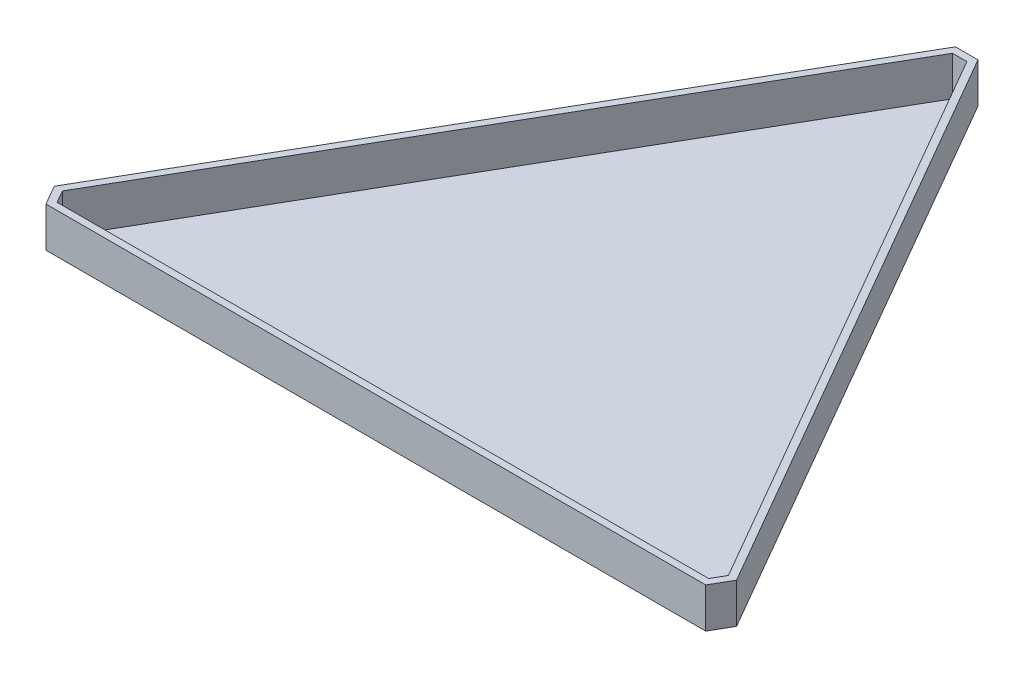
ISO-10303-21;
HEADER;
FILE_DESCRIPTION(('STEP AP214'),'2;1');
FILE_NAME('part.step','',(''),(''),'','','');
FILE_SCHEMA(('AUTOMOTIVE_DESIGN { 1 0 10303 214 1 1 1 1 }'));
ENDSEC;
DATA;
#1=APPLICATION_CONTEXT('core data for automotive mechanical design processes');
#2=APPLICATION_PROTOCOL_DEFINITION('international standard','automotive_design',2000,#1);
#3=PRODUCT_CONTEXT('',#1,'mechanical');
#4=PRODUCT('Part','Part','',(#3));
#5=PRODUCT_RELATED_PRODUCT_CATEGORY('part','',(#4));
#6=PRODUCT_DEFINITION_FORMATION('','',#4);
#7=PRODUCT_DEFINITION_CONTEXT('part definition',#1,'design');
#8=PRODUCT_DEFINITION('design','',#6,#7);
#9=PRODUCT_DEFINITION_SHAPE('','',#8);
#10=(LENGTH_UNIT() NAMED_UNIT(*) SI_UNIT(.MILLI.,.METRE.));
#11=(NAMED_UNIT(*) PLANE_ANGLE_UNIT() SI_UNIT($,.RADIAN.));
#12=(NAMED_UNIT(*) SI_UNIT($,.STERADIAN.) SOLID_ANGLE_UNIT());
#13=UNCERTAINTY_MEASURE_WITH_UNIT(LENGTH_MEASURE(1.E-05),#10,'distance_accuracy_value','');
#14=(GEOMETRIC_REPRESENTATION_CONTEXT(3) GLOBAL_UNCERTAINTY_ASSIGNED_CONTEXT((#13)) GLOBAL_UNIT_ASSIGNED_CONTEXT((#10,
#11,#12)) REPRESENTATION_CONTEXT('',''));
#15=CARTESIAN_POINT('',(0.,0.,0.));
#16=DIRECTION('',(0.,0.,1.));
#17=DIRECTION('',(1.,0.,0.));
#18=AXIS2_PLACEMENT_3D('',#15,#16,#17);
#19=CARTESIAN_POINT('',(0.,0.2,0.));
#20=DIRECTION('',(0.,-1.,0.));
#21=DIRECTION('',(0.,0.,-1.));
#22=AXIS2_PLACEMENT_3D('',#19,#20,#21);
#23=PLANE('',#22);
#24=DIRECTION('',(0.500000615443151,0.,-0.866025048457878));
#25=VECTOR('',#24,1.);
#26=CARTESIAN_POINT('',(229.159432537699,0.2,134.98424917793));
#27=LINE('',#26,#25);
#28=CARTESIAN_POINT('',(229.159432537699,0.200000000000001,134.98424917793));
#29=VERTEX_POINT('',#28);
#30=CARTESIAN_POINT('',(344.716133219392,0.200000000000001,-65.1654990754789));
#31=VERTEX_POINT('',#30);
#32=EDGE_CURVE('E205',#29,#31,#27,.T.);
#33=ORIENTED_EDGE('',*,*,#32,.F.);
#34=DIRECTION('',(0.500096079814934,0.,0.865969924970686));
#35=VECTOR('',#34,1.);
#36=CARTESIAN_POINT('',(229.159432537699,0.2,134.98424917793));
#37=LINE('',#36,#35);
#38=CARTESIAN_POINT('',(231.716666588101,0.200000000000001,139.412373828656));
#39=VERTEX_POINT('',#38);
#40=EDGE_CURVE('E11',#29,#39,#37,.T.);
#41=ORIENTED_EDGE('',*,*,#40,.T.);
#42=DIRECTION('',(1.,0.,0.));
#43=VECTOR('',#42,1.);
#44=CARTESIAN_POINT('',(231.716666588101,0.2,139.412373828656));
#45=LINE('',#44,#43);
#46=CARTESIAN_POINT('',(462.829865412036,0.200000000000001,139.412373828656));
#47=VERTEX_POINT('',#46);
#48=EDGE_CURVE('E41',#39,#47,#45,.T.);
#49=ORIENTED_EDGE('',*,*,#48,.T.);
#50=DIRECTION('',(0.500000000000011,0.,-0.866025403784432));
#51=VECTOR('',#50,1.);
#52=CARTESIAN_POINT('',(462.829865412036,0.2,139.412373828656));
#53=LINE('',#52,#51);
#54=CARTESIAN_POINT('',(465.386248749909,0.2,134.984588003837));
#55=VERTEX_POINT('',#54);
#56=EDGE_CURVE('E210',#47,#55,#53,.T.);
#57=ORIENTED_EDGE('',*,*,#56,.T.);
#58=DIRECTION('',(-0.499999999999987,0.,-0.866025403784446));
#59=VECTOR('',#58,1.);
#60=CARTESIAN_POINT('',(465.386248749909,0.2,134.984588003837));
#61=LINE('',#60,#59);
#62=CARTESIAN_POINT('',(349.829542096343,0.200000000000001,-65.1654990754789));
#63=VERTEX_POINT('',#62);
#64=EDGE_CURVE('E208',#55,#63,#61,.T.);
#65=ORIENTED_EDGE('',*,*,#64,.T.);
#66=DIRECTION('',(1.,0.,0.));
#67=VECTOR('',#66,1.);
#68=CARTESIAN_POINT('',(344.716133219392,0.2,-65.1654990754789));
#69=LINE('',#68,#67);
#70=EDGE_CURVE('E56',#31,#63,#69,.T.);
#71=ORIENTED_EDGE('',*,*,#70,.F.);
#72=EDGE_LOOP('',(#33,#41,#49,#57,#65,#71));
#73=FACE_BOUND('',#72,.T.);
#74=ADVANCED_FACE('F33',(#73),#23,.F.);
#75=CARTESIAN_POINT('',(465.386248749909,14.2,134.984588003837));
#76=DIRECTION('',(-0.866025403784446,0.,0.499999999999988));
#77=DIRECTION('',(0.499999999999988,0.,0.866025403784446));
#78=AXIS2_PLACEMENT_3D('',#75,#76,#77);
#79=PLANE('',#78);
#80=ORIENTED_EDGE('',*,*,#64,.F.);
#81=DIRECTION('',(0.,-1.,0.));
#82=VECTOR('',#81,1.);
#83=CARTESIAN_POINT('',(465.386248749909,14.2,134.984588003837));
#84=LINE('',#83,#82);
#85=CARTESIAN_POINT('',(465.386248749909,14.2,134.984588003837));
#86=VERTEX_POINT('',#85);
#87=EDGE_CURVE('E48',#86,#55,#84,.T.);
#88=ORIENTED_EDGE('',*,*,#87,.F.);
#89=DIRECTION('',(-0.499999999999987,0.,-0.866025403784446));
#90=VECTOR('',#89,1.);
#91=CARTESIAN_POINT('',(465.386248749909,14.2,134.984588003837));
#92=LINE('',#91,#90);
#93=CARTESIAN_POINT('',(349.829542096343,14.2,-65.1654990754789));
#94=VERTEX_POINT('',#93);
#95=EDGE_CURVE('E123',#86,#94,#92,.T.);
#96=ORIENTED_EDGE('',*,*,#95,.T.);
#97=DIRECTION('',(0.,-1.,0.));
#98=VECTOR('',#97,1.);
#99=CARTESIAN_POINT('',(349.829542096343,14.2,-65.1654990754789));
#100=LINE('',#99,#98);
#101=EDGE_CURVE('E125',#94,#63,#100,.T.);
#102=ORIENTED_EDGE('',*,*,#101,.T.);
#103=EDGE_LOOP('',(#80,#88,#96,#102));
#104=FACE_BOUND('',#103,.T.);
#105=ADVANCED_FACE('F124',(#104),#79,.T.);
#106=CARTESIAN_POINT('',(344.716133219392,14.2,-65.1654990754789));
#107=DIRECTION('',(0.,0.,1.));
#108=DIRECTION('',(1.,0.,0.));
#109=AXIS2_PLACEMENT_3D('',#106,#107,#108);
#110=PLANE('',#109);
#111=ORIENTED_EDGE('',*,*,#70,.T.);
#112=ORIENTED_EDGE('',*,*,#101,.F.);
#113=DIRECTION('',(-1.,0.,0.));
#114=VECTOR('',#113,1.);
#115=CARTESIAN_POINT('',(344.716133219392,14.2,-65.1654990754789));
#116=LINE('',#115,#114);
#117=CARTESIAN_POINT('',(344.716133219392,14.2,-65.1654990754789));
#118=VERTEX_POINT('',#117);
#119=EDGE_CURVE('E130',#94,#118,#116,.T.);
#120=ORIENTED_EDGE('',*,*,#119,.T.);
#121=DIRECTION('',(0.,-1.,0.));
#122=VECTOR('',#121,1.);
#123=CARTESIAN_POINT('',(344.716133219392,14.2,-65.1654990754789));
#124=LINE('',#123,#122);
#125=EDGE_CURVE('E135',#118,#31,#124,.T.);
#126=ORIENTED_EDGE('',*,*,#125,.T.);
#127=EDGE_LOOP('',(#111,#112,#120,#126));
#128=FACE_BOUND('',#127,.T.);
#129=ADVANCED_FACE('F132',(#128),#110,.T.);
#130=CARTESIAN_POINT('',(229.159432537699,14.2,134.98424917793));
#131=DIRECTION('',(0.866025048457878,0.,0.500000615443151));
#132=DIRECTION('',(0.500000615443151,0.,-0.866025048457878));
#133=AXIS2_PLACEMENT_3D('',#130,#131,#132);
#134=PLANE('',#133);
#135=ORIENTED_EDGE('',*,*,#32,.T.);
#136=ORIENTED_EDGE('',*,*,#125,.F.);
#137=DIRECTION('',(-0.500000615443151,0.,0.866025048457878));
#138=VECTOR('',#137,1.);
#139=CARTESIAN_POINT('',(229.159432537699,14.2,134.98424917793));
#140=LINE('',#139,#138);
#141=CARTESIAN_POINT('',(229.159432537699,14.2,134.98424917793));
#142=VERTEX_POINT('',#141);
#143=EDGE_CURVE('E140',#118,#142,#140,.T.);
#144=ORIENTED_EDGE('',*,*,#143,.T.);
#145=DIRECTION('',(0.,-1.,0.));
#146=VECTOR('',#145,1.);
#147=CARTESIAN_POINT('',(229.159432537699,14.2,134.98424917793));
#148=LINE('',#147,#146);
#149=EDGE_CURVE('E158',#142,#29,#148,.T.);
#150=ORIENTED_EDGE('',*,*,#149,.T.);
#151=EDGE_LOOP('',(#135,#136,#144,#150));
#152=FACE_BOUND('',#151,.T.);
#153=ADVANCED_FACE('F264',(#152),#134,.T.);
#154=CARTESIAN_POINT('',(229.159432537699,14.2,134.98424917793));
#155=DIRECTION('',(0.865969924970686,0.,-0.500096079814934));
#156=DIRECTION('',(-0.500096079814934,0.,-0.865969924970686));
#157=AXIS2_PLACEMENT_3D('',#154,#155,#156);
#158=PLANE('',#157);
#159=ORIENTED_EDGE('',*,*,#40,.F.);
#160=ORIENTED_EDGE('',*,*,#149,.F.);
#161=DIRECTION('',(0.500096079814934,0.,0.865969924970686));
#162=VECTOR('',#161,1.);
#163=CARTESIAN_POINT('',(229.159432537699,14.2,134.98424917793));
#164=LINE('',#163,#162);
#165=CARTESIAN_POINT('',(231.716666588101,14.2,139.412373828656));
#166=VERTEX_POINT('',#165);
#167=EDGE_CURVE('E142',#142,#166,#164,.T.);
#168=ORIENTED_EDGE('',*,*,#167,.T.);
#169=DIRECTION('',(0.,-1.,0.));
#170=VECTOR('',#169,1.);
#171=CARTESIAN_POINT('',(231.716666588101,14.2,139.412373828656));
#172=LINE('',#171,#170);
#173=EDGE_CURVE('E155',#166,#39,#172,.T.);
#174=ORIENTED_EDGE('',*,*,#173,.T.);
#175=EDGE_LOOP('',(#159,#160,#168,#174));
#176=FACE_BOUND('',#175,.T.);
#177=ADVANCED_FACE('F220',(#176),#158,.T.);
#178=CARTESIAN_POINT('',(231.716666588101,14.2,139.412373828656));
#179=DIRECTION('',(0.,0.,-1.));
#180=DIRECTION('',(-1.,0.,0.));
#181=AXIS2_PLACEMENT_3D('',#178,#179,#180);
#182=PLANE('',#181);
#183=ORIENTED_EDGE('',*,*,#48,.F.);
#184=ORIENTED_EDGE('',*,*,#173,.F.);
#185=DIRECTION('',(1.,0.,0.));
#186=VECTOR('',#185,1.);
#187=CARTESIAN_POINT('',(231.716666588101,14.2,139.412373828656));
#188=LINE('',#187,#186);
#189=CARTESIAN_POINT('',(462.829865412036,14.2,139.412373828656));
#190=VERTEX_POINT('',#189);
#191=EDGE_CURVE('E146',#166,#190,#188,.T.);
#192=ORIENTED_EDGE('',*,*,#191,.T.);
#193=DIRECTION('',(0.,-1.,0.));
#194=VECTOR('',#193,1.);
#195=CARTESIAN_POINT('',(462.829865412036,14.2,139.412373828656));
#196=LINE('',#195,#194);
#197=EDGE_CURVE('E152',#190,#47,#196,.T.);
#198=ORIENTED_EDGE('',*,*,#197,.T.);
#199=EDGE_LOOP('',(#183,#184,#192,#198));
#200=FACE_BOUND('',#199,.T.);
#201=ADVANCED_FACE('F217',(#200),#182,.T.);
#202=CARTESIAN_POINT('',(462.829865412036,14.2,139.412373828656));
#203=DIRECTION('',(-0.866025403784432,0.,-0.500000000000011));
#204=DIRECTION('',(-0.500000000000011,0.,0.866025403784432));
#205=AXIS2_PLACEMENT_3D('',#202,#203,#204);
#206=PLANE('',#205);
#207=ORIENTED_EDGE('',*,*,#56,.F.);
#208=ORIENTED_EDGE('',*,*,#197,.F.);
#209=DIRECTION('',(0.500000000000011,0.,-0.866025403784432));
#210=VECTOR('',#209,1.);
#211=CARTESIAN_POINT('',(462.829865412036,14.2,139.412373828656));
#212=LINE('',#211,#210);
#213=EDGE_CURVE('E149',#190,#86,#212,.T.);
#214=ORIENTED_EDGE('',*,*,#213,.T.);
#215=ORIENTED_EDGE('',*,*,#87,.T.);
#216=EDGE_LOOP('',(#207,#208,#214,#215));
#217=FACE_BOUND('',#216,.T.);
#218=ADVANCED_FACE('F222',(#217),#206,.T.);
#219=CARTESIAN_POINT('',(0.,14.2,0.));
#220=DIRECTION('',(0.,-1.,0.));
#221=DIRECTION('',(0.,0.,-1.));
#222=AXIS2_PLACEMENT_3D('',#219,#220,#221);
#223=PLANE('',#222);
#224=DIRECTION('',(1.,0.,0.));
#225=VECTOR('',#224,1.);
#226=CARTESIAN_POINT('',(230.273290915127,14.2,141.912373828656));
#227=LINE('',#226,#225);
#228=CARTESIAN_POINT('',(230.273290915127,14.2,141.912373828656));
#229=VERTEX_POINT('',#228);
#230=CARTESIAN_POINT('',(464.27324108501,14.2,141.912373828656));
#231=VERTEX_POINT('',#230);
#232=EDGE_CURVE('E162',#229,#231,#227,.T.);
#233=ORIENTED_EDGE('',*,*,#232,.T.);
#234=DIRECTION('',(0.500000000000019,0.,-0.866025403784428));
#235=VECTOR('',#234,1.);
#236=CARTESIAN_POINT('',(468.273000095857,14.2,134.984588003837));
#237=LINE('',#236,#235);
#238=CARTESIAN_POINT('',(468.273000095857,14.2,134.984588003837));
#239=VERTEX_POINT('',#238);
#240=EDGE_CURVE('E165',#231,#239,#237,.T.);
#241=ORIENTED_EDGE('',*,*,#240,.T.);
#242=DIRECTION('',(-0.499999999999987,0.,-0.866025403784446));
#243=VECTOR('',#242,1.);
#244=CARTESIAN_POINT('',(351.272917769317,14.2,-67.6654990754789));
#245=LINE('',#244,#243);
#246=CARTESIAN_POINT('',(351.272917769317,14.2,-67.6654990754789));
#247=VERTEX_POINT('',#246);
#248=EDGE_CURVE('E168',#239,#247,#245,.T.);
#249=ORIENTED_EDGE('',*,*,#248,.T.);
#250=DIRECTION('',(-1.,0.,0.));
#251=VECTOR('',#250,1.);
#252=CARTESIAN_POINT('',(343.272757546418,14.2,-67.6654990754789));
#253=LINE('',#252,#251);
#254=CARTESIAN_POINT('',(343.272757546418,14.2,-67.6654990754789));
#255=VERTEX_POINT('',#254);
#256=EDGE_CURVE('E170',#247,#255,#253,.T.);
#257=ORIENTED_EDGE('',*,*,#256,.T.);
#258=DIRECTION('',(-0.500000607850711,0.,0.866025052841383));
#259=VECTOR('',#258,1.);
#260=CARTESIAN_POINT('',(226.272682946466,14.2,134.984246138676));
#261=LINE('',#260,#259);
#262=CARTESIAN_POINT('',(226.272682946466,14.2,134.984246138676));
#263=VERTEX_POINT('',#262);
#264=EDGE_CURVE('E172',#255,#263,#261,.T.);
#265=ORIENTED_EDGE('',*,*,#264,.T.);
#266=DIRECTION('',(0.500061082735036,0.,0.865990134778603));
#267=VECTOR('',#266,1.);
#268=CARTESIAN_POINT('',(230.273290915127,14.2,141.912373828656));
#269=LINE('',#268,#267);
#270=EDGE_CURVE('E174',#263,#229,#269,.T.);
#271=ORIENTED_EDGE('',*,*,#270,.T.);
#272=EDGE_LOOP('',(#233,#241,#249,#257,#265,#271));
#273=FACE_BOUND('',#272,.T.);
#274=ORIENTED_EDGE('',*,*,#95,.F.);
#275=ORIENTED_EDGE('',*,*,#213,.F.);
#276=ORIENTED_EDGE('',*,*,#191,.F.);
#277=ORIENTED_EDGE('',*,*,#167,.F.);
#278=ORIENTED_EDGE('',*,*,#143,.F.);
#279=ORIENTED_EDGE('',*,*,#119,.F.);
#280=EDGE_LOOP('',(#274,#275,#276,#277,#278,#279));
#281=FACE_BOUND('',#280,.T.);
#282=ADVANCED_FACE('F138',(#273,#281),#223,.F.);
#283=CARTESIAN_POINT('',(230.273290915127,14.2,141.912373828656));
#284=DIRECTION('',(0.,0.,-1.));
#285=DIRECTION('',(-1.,0.,0.));
#286=AXIS2_PLACEMENT_3D('',#283,#284,#285);
#287=PLANE('',#286);
#288=DIRECTION('',(1.,0.,0.));
#289=VECTOR('',#288,1.);
#290=CARTESIAN_POINT('',(230.273290915127,0.,141.912373828656));
#291=LINE('',#290,#289);
#292=CARTESIAN_POINT('',(230.273290915127,0.,141.912373828656));
#293=VERTEX_POINT('',#292);
#294=CARTESIAN_POINT('',(464.27324108501,0.,141.912373828656));
#295=VERTEX_POINT('',#294);
#296=EDGE_CURVE('E134',#293,#295,#291,.T.);
#297=ORIENTED_EDGE('',*,*,#296,.T.);
#298=DIRECTION('',(0.,-1.,0.));
#299=VECTOR('',#298,1.);
#300=CARTESIAN_POINT('',(464.27324108501,14.2,141.912373828656));
#301=LINE('',#300,#299);
#302=EDGE_CURVE('E202',#231,#295,#301,.T.);
#303=ORIENTED_EDGE('',*,*,#302,.F.);
#304=ORIENTED_EDGE('',*,*,#232,.F.);
#305=DIRECTION('',(0.,-1.,0.));
#306=VECTOR('',#305,1.);
#307=CARTESIAN_POINT('',(230.273290915127,14.2,141.912373828656));
#308=LINE('',#307,#306);
#309=EDGE_CURVE('E176',#229,#293,#308,.T.);
#310=ORIENTED_EDGE('',*,*,#309,.T.);
#311=EDGE_LOOP('',(#297,#303,#304,#310));
#312=FACE_BOUND('',#311,.T.);
#313=ADVANCED_FACE('F229',(#312),#287,.F.);
#314=CARTESIAN_POINT('',(468.273000095857,14.2,134.984588003837));
#315=DIRECTION('',(-0.866025403784428,0.,-0.500000000000019));
#316=DIRECTION('',(-0.500000000000019,0.,0.866025403784428));
#317=AXIS2_PLACEMENT_3D('',#314,#315,#316);
#318=PLANE('',#317);
#319=DIRECTION('',(0.500000000000019,0.,-0.866025403784428));
#320=VECTOR('',#319,1.);
#321=CARTESIAN_POINT('',(468.273000095857,0.,134.984588003837));
#322=LINE('',#321,#320);
#323=CARTESIAN_POINT('',(468.273000095857,0.,134.984588003837));
#324=VERTEX_POINT('',#323);
#325=EDGE_CURVE('E179',#295,#324,#322,.T.);
#326=ORIENTED_EDGE('',*,*,#325,.T.);
#327=DIRECTION('',(0.,-1.,0.));
#328=VECTOR('',#327,1.);
#329=CARTESIAN_POINT('',(468.273000095857,14.2,134.984588003837));
#330=LINE('',#329,#328);
#331=EDGE_CURVE('E199',#239,#324,#330,.T.);
#332=ORIENTED_EDGE('',*,*,#331,.F.);
#333=ORIENTED_EDGE('',*,*,#240,.F.);
#334=ORIENTED_EDGE('',*,*,#302,.T.);
#335=EDGE_LOOP('',(#326,#332,#333,#334));
#336=FACE_BOUND('',#335,.T.);
#337=ADVANCED_FACE('F241',(#336),#318,.F.);
#338=CARTESIAN_POINT('',(351.272917769317,14.2,-67.6654990754789));
#339=DIRECTION('',(-0.866025403784446,0.,0.499999999999987));
#340=DIRECTION('',(0.499999999999988,0.,0.866025403784446));
#341=AXIS2_PLACEMENT_3D('',#338,#339,#340);
#342=PLANE('',#341);
#343=DIRECTION('',(-0.499999999999987,0.,-0.866025403784446));
#344=VECTOR('',#343,1.);
#345=CARTESIAN_POINT('',(351.272917769317,0.,-67.6654990754789));
#346=LINE('',#345,#344);
#347=CARTESIAN_POINT('',(351.272917769317,0.,-67.6654990754789));
#348=VERTEX_POINT('',#347);
#349=EDGE_CURVE('E181',#324,#348,#346,.T.);
#350=ORIENTED_EDGE('',*,*,#349,.T.);
#351=DIRECTION('',(0.,-1.,0.));
#352=VECTOR('',#351,1.);
#353=CARTESIAN_POINT('',(351.272917769317,14.2,-67.6654990754789));
#354=LINE('',#353,#352);
#355=EDGE_CURVE('E196',#247,#348,#354,.T.);
#356=ORIENTED_EDGE('',*,*,#355,.F.);
#357=ORIENTED_EDGE('',*,*,#248,.F.);
#358=ORIENTED_EDGE('',*,*,#331,.T.);
#359=EDGE_LOOP('',(#350,#356,#357,#358));
#360=FACE_BOUND('',#359,.T.);
#361=ADVANCED_FACE('F245',(#360),#342,.F.);
#362=CARTESIAN_POINT('',(343.272757546418,14.2,-67.6654990754789));
#363=DIRECTION('',(0.,0.,1.));
#364=DIRECTION('',(1.,0.,0.));
#365=AXIS2_PLACEMENT_3D('',#362,#363,#364);
#366=PLANE('',#365);
#367=DIRECTION('',(-1.,0.,0.));
#368=VECTOR('',#367,1.);
#369=CARTESIAN_POINT('',(343.272757546418,0.,-67.6654990754789));
#370=LINE('',#369,#368);
#371=CARTESIAN_POINT('',(343.272757546418,0.,-67.6654990754789));
#372=VERTEX_POINT('',#371);
#373=EDGE_CURVE('E183',#348,#372,#370,.T.);
#374=ORIENTED_EDGE('',*,*,#373,.T.);
#375=DIRECTION('',(0.,-1.,0.));
#376=VECTOR('',#375,1.);
#377=CARTESIAN_POINT('',(343.272757546418,14.2,-67.6654990754789));
#378=LINE('',#377,#376);
#379=EDGE_CURVE('E193',#255,#372,#378,.T.);
#380=ORIENTED_EDGE('',*,*,#379,.F.);
#381=ORIENTED_EDGE('',*,*,#256,.F.);
#382=ORIENTED_EDGE('',*,*,#355,.T.);
#383=EDGE_LOOP('',(#374,#380,#381,#382));
#384=FACE_BOUND('',#383,.T.);
#385=ADVANCED_FACE('F249',(#384),#366,.F.);
#386=CARTESIAN_POINT('',(226.272682946466,14.2,134.984246138676));
#387=DIRECTION('',(0.866025052841383,0.,0.50000060785071));
#388=DIRECTION('',(0.500000607850711,0.,-0.866025052841383));
#389=AXIS2_PLACEMENT_3D('',#386,#387,#388);
#390=PLANE('',#389);
#391=DIRECTION('',(-0.500000607850711,0.,0.866025052841383));
#392=VECTOR('',#391,1.);
#393=CARTESIAN_POINT('',(226.272682946466,0.,134.984246138676));
#394=LINE('',#393,#392);
#395=CARTESIAN_POINT('',(226.272682946466,0.,134.984246138676));
#396=VERTEX_POINT('',#395);
#397=EDGE_CURVE('E185',#372,#396,#394,.T.);
#398=ORIENTED_EDGE('',*,*,#397,.T.);
#399=DIRECTION('',(0.,-1.,0.));
#400=VECTOR('',#399,1.);
#401=CARTESIAN_POINT('',(226.272682946466,14.2,134.984246138676));
#402=LINE('',#401,#400);
#403=EDGE_CURVE('E190',#263,#396,#402,.T.);
#404=ORIENTED_EDGE('',*,*,#403,.F.);
#405=ORIENTED_EDGE('',*,*,#264,.F.);
#406=ORIENTED_EDGE('',*,*,#379,.T.);
#407=EDGE_LOOP('',(#398,#404,#405,#406));
#408=FACE_BOUND('',#407,.T.);
#409=ADVANCED_FACE('F253',(#408),#390,.F.);
#410=CARTESIAN_POINT('',(230.273290915127,14.2,141.912373828656));
#411=DIRECTION('',(0.865990134778603,0.,-0.500061082735036));
#412=DIRECTION('',(-0.500061082735036,0.,-0.865990134778603));
#413=AXIS2_PLACEMENT_3D('',#410,#411,#412);
#414=PLANE('',#413);
#415=DIRECTION('',(0.500061082735036,0.,0.865990134778603));
#416=VECTOR('',#415,1.);
#417=CARTESIAN_POINT('',(230.273290915127,0.,141.912373828656));
#418=LINE('',#417,#416);
#419=EDGE_CURVE('E166',#396,#293,#418,.T.);
#420=ORIENTED_EDGE('',*,*,#419,.T.);
#421=ORIENTED_EDGE('',*,*,#309,.F.);
#422=ORIENTED_EDGE('',*,*,#270,.F.);
#423=ORIENTED_EDGE('',*,*,#403,.T.);
#424=EDGE_LOOP('',(#420,#421,#422,#423));
#425=FACE_BOUND('',#424,.T.);
#426=ADVANCED_FACE('F257',(#425),#414,.F.);
#427=CARTESIAN_POINT('',(0.,0.,0.));
#428=DIRECTION('',(0.,-1.,0.));
#429=DIRECTION('',(0.,0.,-1.));
#430=AXIS2_PLACEMENT_3D('',#427,#428,#429);
#431=PLANE('',#430);
#432=ORIENTED_EDGE('',*,*,#296,.F.);
#433=ORIENTED_EDGE('',*,*,#419,.F.);
#434=ORIENTED_EDGE('',*,*,#397,.F.);
#435=ORIENTED_EDGE('',*,*,#373,.F.);
#436=ORIENTED_EDGE('',*,*,#349,.F.);
#437=ORIENTED_EDGE('',*,*,#325,.F.);
#438=EDGE_LOOP('',(#432,#433,#434,#435,#436,#437));
#439=FACE_BOUND('',#438,.T.);
#440=ADVANCED_FACE('F35',(#439),#431,.T.);
#441=CLOSED_SHELL('',(#74,#105,#129,#153,#177,#201,#218,#282,#313,#337,#361,#385,#409,#426,#440));
#442=MANIFOLD_SOLID_BREP('B2',#441);
#443=ADVANCED_BREP_SHAPE_REPRESENTATION('',(#18,#442),#14);
#444=SHAPE_DEFINITION_REPRESENTATION(#9,#443);
ENDSEC;
END-ISO-10303-21;
